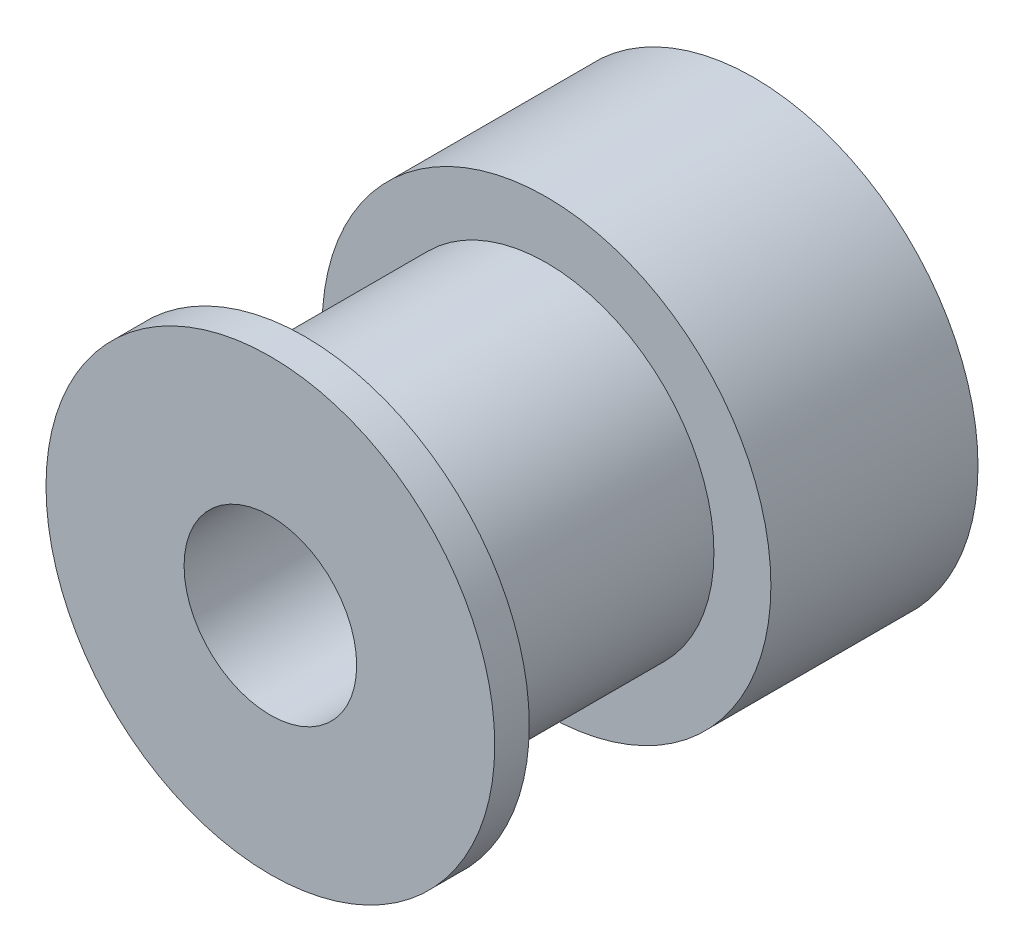
ISO-10303-21;
HEADER;
FILE_DESCRIPTION(('STEP AP214'),'2;1');
FILE_NAME('part.step','',(''),(''),'','','');
FILE_SCHEMA(('AUTOMOTIVE_DESIGN { 1 0 10303 214 1 1 1 1 }'));
ENDSEC;
DATA;
#1=APPLICATION_CONTEXT('core data for automotive mechanical design processes');
#2=APPLICATION_PROTOCOL_DEFINITION('international standard','automotive_design',2000,#1);
#3=PRODUCT_CONTEXT('',#1,'mechanical');
#4=PRODUCT('Part','Part','',(#3));
#5=PRODUCT_RELATED_PRODUCT_CATEGORY('part','',(#4));
#6=PRODUCT_DEFINITION_FORMATION('','',#4);
#7=PRODUCT_DEFINITION_CONTEXT('part definition',#1,'design');
#8=PRODUCT_DEFINITION('design','',#6,#7);
#9=PRODUCT_DEFINITION_SHAPE('','',#8);
#10=(LENGTH_UNIT() NAMED_UNIT(*) SI_UNIT(.MILLI.,.METRE.));
#11=(NAMED_UNIT(*) PLANE_ANGLE_UNIT() SI_UNIT($,.RADIAN.));
#12=(NAMED_UNIT(*) SI_UNIT($,.STERADIAN.) SOLID_ANGLE_UNIT());
#13=UNCERTAINTY_MEASURE_WITH_UNIT(LENGTH_MEASURE(1.E-05),#10,'distance_accuracy_value','');
#14=(GEOMETRIC_REPRESENTATION_CONTEXT(3) GLOBAL_UNCERTAINTY_ASSIGNED_CONTEXT((#13)) GLOBAL_UNIT_ASSIGNED_CONTEXT((#10,
#11,#12)) REPRESENTATION_CONTEXT('',''));
#15=CARTESIAN_POINT('',(0.,0.,0.));
#16=DIRECTION('',(0.,0.,1.));
#17=DIRECTION('',(1.,0.,0.));
#18=AXIS2_PLACEMENT_3D('',#15,#16,#17);
#19=CARTESIAN_POINT('',(0.,0.,6.));
#20=DIRECTION('',(0.,0.,1.));
#21=DIRECTION('',(1.,0.,0.));
#22=AXIS2_PLACEMENT_3D('',#19,#20,#21);
#23=PLANE('',#22);
#24=CARTESIAN_POINT('',(0.,0.,6.));
#25=DIRECTION('',(0.,0.,1.));
#26=DIRECTION('',(1.,0.,0.));
#27=AXIS2_PLACEMENT_3D('',#24,#25,#26);
#28=CIRCLE('',#27,4.85);
#29=CARTESIAN_POINT('',(4.85,0.,6.));
#30=VERTEX_POINT('',#29);
#31=EDGE_CURVE('E10',#30,#30,#28,.T.);
#32=ORIENTED_EDGE('',*,*,#31,.F.);
#33=EDGE_LOOP('',(#32));
#34=FACE_BOUND('',#33,.T.);
#35=CARTESIAN_POINT('',(0.,0.,6.));
#36=DIRECTION('',(0.,0.,1.));
#37=DIRECTION('',(1.,0.,0.));
#38=AXIS2_PLACEMENT_3D('',#35,#36,#37);
#39=CIRCLE('',#38,6.5);
#40=CARTESIAN_POINT('',(6.5,0.,6.));
#41=VERTEX_POINT('',#40);
#42=EDGE_CURVE('E46',#41,#41,#39,.T.);
#43=ORIENTED_EDGE('',*,*,#42,.T.);
#44=EDGE_LOOP('',(#43));
#45=FACE_BOUND('',#44,.T.);
#46=ADVANCED_FACE('F37',(#34,#45),#23,.T.);
#47=CARTESIAN_POINT('',(0.,0.,0.));
#48=DIRECTION('',(0.,0.,1.));
#49=DIRECTION('',(1.,0.,0.));
#50=AXIS2_PLACEMENT_3D('',#47,#48,#49);
#51=PLANE('',#50);
#52=CARTESIAN_POINT('',(0.,0.,0.));
#53=DIRECTION('',(0.,0.,1.));
#54=DIRECTION('',(1.,0.,0.));
#55=AXIS2_PLACEMENT_3D('',#52,#53,#54);
#56=CIRCLE('',#55,6.5);
#57=CARTESIAN_POINT('',(6.5,0.,0.));
#58=VERTEX_POINT('',#57);
#59=EDGE_CURVE('E41',#58,#58,#56,.T.);
#60=ORIENTED_EDGE('',*,*,#59,.F.);
#61=EDGE_LOOP('',(#60));
#62=FACE_BOUND('',#61,.T.);
#63=CARTESIAN_POINT('',(0.,0.,0.));
#64=DIRECTION('',(0.,0.,1.));
#65=DIRECTION('',(1.,0.,0.));
#66=AXIS2_PLACEMENT_3D('',#63,#64,#65);
#67=CIRCLE('',#66,2.5);
#68=CARTESIAN_POINT('',(2.5,0.,0.));
#69=VERTEX_POINT('',#68);
#70=EDGE_CURVE('E56',#69,#69,#67,.T.);
#71=ORIENTED_EDGE('',*,*,#70,.T.);
#72=EDGE_LOOP('',(#71));
#73=FACE_BOUND('',#72,.T.);
#74=ADVANCED_FACE('F98',(#62,#73),#51,.F.);
#75=CARTESIAN_POINT('',(0.,0.,6.));
#76=DIRECTION('',(0.,0.,-1.));
#77=DIRECTION('',(-1.,0.,0.));
#78=AXIS2_PLACEMENT_3D('',#75,#76,#77);
#79=CYLINDRICAL_SURFACE('',#78,6.5);
#80=ORIENTED_EDGE('',*,*,#42,.F.);
#81=EDGE_LOOP('',(#80));
#82=FACE_BOUND('',#81,.T.);
#83=ORIENTED_EDGE('',*,*,#59,.T.);
#84=EDGE_LOOP('',(#83));
#85=FACE_BOUND('',#84,.T.);
#86=ADVANCED_FACE('F39',(#82,#85),#79,.T.);
#87=CARTESIAN_POINT('',(0.,0.,6.));
#88=DIRECTION('',(0.,0.,-1.));
#89=DIRECTION('',(-1.,0.,0.));
#90=AXIS2_PLACEMENT_3D('',#87,#88,#89);
#91=CYLINDRICAL_SURFACE('',#90,2.5);
#92=ORIENTED_EDGE('',*,*,#70,.F.);
#93=EDGE_LOOP('',(#92));
#94=FACE_BOUND('',#93,.T.);
#95=CARTESIAN_POINT('',(0.,0.,14.));
#96=DIRECTION('',(0.,0.,1.));
#97=DIRECTION('',(1.,0.,0.));
#98=AXIS2_PLACEMENT_3D('',#95,#96,#97);
#99=CIRCLE('',#98,2.5);
#100=CARTESIAN_POINT('',(2.5,0.,14.));
#101=VERTEX_POINT('',#100);
#102=EDGE_CURVE('E76',#101,#101,#99,.T.);
#103=ORIENTED_EDGE('',*,*,#102,.T.);
#104=EDGE_LOOP('',(#103));
#105=FACE_BOUND('',#104,.T.);
#106=ADVANCED_FACE('F82',(#94,#105),#91,.F.);
#107=CARTESIAN_POINT('',(0.,0.,13.));
#108=DIRECTION('',(0.,0.,-1.));
#109=DIRECTION('',(-1.,0.,0.));
#110=AXIS2_PLACEMENT_3D('',#107,#108,#109);
#111=CYLINDRICAL_SURFACE('',#110,4.85);
#112=CARTESIAN_POINT('',(0.,0.,13.));
#113=DIRECTION('',(0.,0.,1.));
#114=DIRECTION('',(1.,0.,0.));
#115=AXIS2_PLACEMENT_3D('',#112,#113,#114);
#116=CIRCLE('',#115,4.85);
#117=CARTESIAN_POINT('',(4.85,0.,13.));
#118=VERTEX_POINT('',#117);
#119=EDGE_CURVE('E54',#118,#118,#116,.T.);
#120=ORIENTED_EDGE('',*,*,#119,.F.);
#121=EDGE_LOOP('',(#120));
#122=FACE_BOUND('',#121,.T.);
#123=ORIENTED_EDGE('',*,*,#31,.T.);
#124=EDGE_LOOP('',(#123));
#125=FACE_BOUND('',#124,.T.);
#126=ADVANCED_FACE('F87',(#122,#125),#111,.T.);
#127=CARTESIAN_POINT('',(0.,0.,14.));
#128=DIRECTION('',(0.,0.,1.));
#129=DIRECTION('',(1.,0.,0.));
#130=AXIS2_PLACEMENT_3D('',#127,#128,#129);
#131=PLANE('',#130);
#132=CARTESIAN_POINT('',(0.,0.,14.));
#133=DIRECTION('',(0.,0.,1.));
#134=DIRECTION('',(1.,0.,0.));
#135=AXIS2_PLACEMENT_3D('',#132,#133,#134);
#136=CIRCLE('',#135,6.5);
#137=CARTESIAN_POINT('',(6.5,0.,14.));
#138=VERTEX_POINT('',#137);
#139=EDGE_CURVE('E65',#138,#138,#136,.T.);
#140=ORIENTED_EDGE('',*,*,#139,.T.);
#141=EDGE_LOOP('',(#140));
#142=FACE_BOUND('',#141,.T.);
#143=ORIENTED_EDGE('',*,*,#102,.F.);
#144=EDGE_LOOP('',(#143));
#145=FACE_BOUND('',#144,.T.);
#146=ADVANCED_FACE('F84',(#142,#145),#131,.T.);
#147=CARTESIAN_POINT('',(0.,0.,13.));
#148=DIRECTION('',(0.,0.,1.));
#149=DIRECTION('',(1.,0.,0.));
#150=AXIS2_PLACEMENT_3D('',#147,#148,#149);
#151=PLANE('',#150);
#152=ORIENTED_EDGE('',*,*,#119,.T.);
#153=EDGE_LOOP('',(#152));
#154=FACE_BOUND('',#153,.T.);
#155=CARTESIAN_POINT('',(0.,0.,13.));
#156=DIRECTION('',(0.,0.,1.));
#157=DIRECTION('',(1.,0.,0.));
#158=AXIS2_PLACEMENT_3D('',#155,#156,#157);
#159=CIRCLE('',#158,6.5);
#160=CARTESIAN_POINT('',(6.5,0.,13.));
#161=VERTEX_POINT('',#160);
#162=EDGE_CURVE('E70',#161,#161,#159,.T.);
#163=ORIENTED_EDGE('',*,*,#162,.F.);
#164=EDGE_LOOP('',(#163));
#165=FACE_BOUND('',#164,.T.);
#166=ADVANCED_FACE('F86',(#154,#165),#151,.F.);
#167=CARTESIAN_POINT('',(0.,0.,14.));
#168=DIRECTION('',(0.,0.,-1.));
#169=DIRECTION('',(-1.,0.,0.));
#170=AXIS2_PLACEMENT_3D('',#167,#168,#169);
#171=CYLINDRICAL_SURFACE('',#170,6.5);
#172=ORIENTED_EDGE('',*,*,#139,.F.);
#173=EDGE_LOOP('',(#172));
#174=FACE_BOUND('',#173,.T.);
#175=ORIENTED_EDGE('',*,*,#162,.T.);
#176=EDGE_LOOP('',(#175));
#177=FACE_BOUND('',#176,.T.);
#178=ADVANCED_FACE('F93',(#174,#177),#171,.T.);
#179=CLOSED_SHELL('',(#46,#74,#86,#106,#126,#146,#166,#178));
#180=MANIFOLD_SOLID_BREP('B2',#179);
#181=ADVANCED_BREP_SHAPE_REPRESENTATION('',(#18,#180),#14);
#182=SHAPE_DEFINITION_REPRESENTATION(#9,#181);
ENDSEC;
END-ISO-10303-21;
